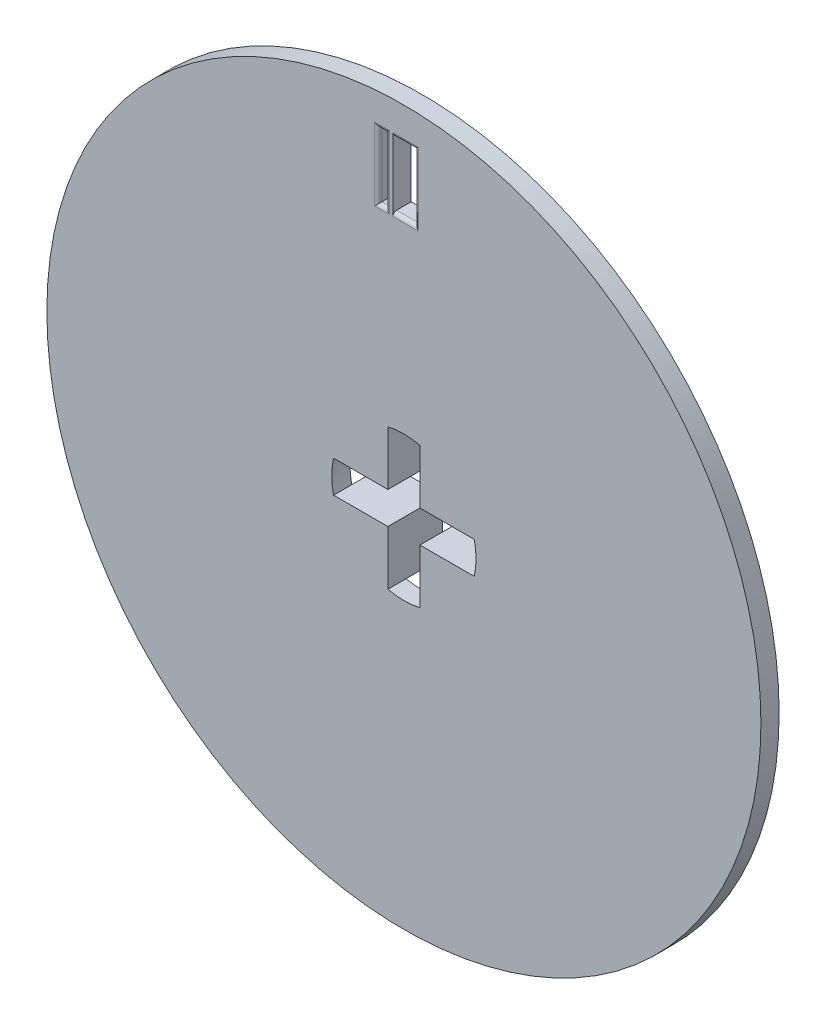
ISO-10303-21;
HEADER;
FILE_DESCRIPTION(('STEP AP214'),'2;1');
FILE_NAME('part.step','',(''),(''),'','','');
FILE_SCHEMA(('AUTOMOTIVE_DESIGN { 1 0 10303 214 1 1 1 1 }'));
ENDSEC;
DATA;
#1=APPLICATION_CONTEXT('core data for automotive mechanical design processes');
#2=APPLICATION_PROTOCOL_DEFINITION('international standard','automotive_design',2000,#1);
#3=PRODUCT_CONTEXT('',#1,'mechanical');
#4=PRODUCT('Part','Part','',(#3));
#5=PRODUCT_RELATED_PRODUCT_CATEGORY('part','',(#4));
#6=PRODUCT_DEFINITION_FORMATION('','',#4);
#7=PRODUCT_DEFINITION_CONTEXT('part definition',#1,'design');
#8=PRODUCT_DEFINITION('design','',#6,#7);
#9=PRODUCT_DEFINITION_SHAPE('','',#8);
#10=(LENGTH_UNIT() NAMED_UNIT(*) SI_UNIT(.MILLI.,.METRE.));
#11=(NAMED_UNIT(*) PLANE_ANGLE_UNIT() SI_UNIT($,.RADIAN.));
#12=(NAMED_UNIT(*) SI_UNIT($,.STERADIAN.) SOLID_ANGLE_UNIT());
#13=UNCERTAINTY_MEASURE_WITH_UNIT(LENGTH_MEASURE(1.E-05),#10,'distance_accuracy_value','');
#14=(GEOMETRIC_REPRESENTATION_CONTEXT(3) GLOBAL_UNCERTAINTY_ASSIGNED_CONTEXT((#13)) GLOBAL_UNIT_ASSIGNED_CONTEXT((#10,
#11,#12)) REPRESENTATION_CONTEXT('',''));
#15=CARTESIAN_POINT('',(0.,0.,0.));
#16=DIRECTION('',(0.,0.,1.));
#17=DIRECTION('',(1.,0.,0.));
#18=AXIS2_PLACEMENT_3D('',#15,#16,#17);
#19=CARTESIAN_POINT('',(0.,0.,2.5));
#20=DIRECTION('',(0.,0.,-1.));
#21=DIRECTION('',(-1.,0.,0.));
#22=AXIS2_PLACEMENT_3D('',#19,#20,#21);
#23=CYLINDRICAL_SURFACE('',#22,9.9);
#24=CARTESIAN_POINT('',(0.,0.,0.));
#25=DIRECTION('',(0.,0.,1.));
#26=DIRECTION('',(1.,0.,0.));
#27=AXIS2_PLACEMENT_3D('',#24,#25,#26);
#28=CIRCLE('',#27,9.9);
#29=CARTESIAN_POINT('',(9.65246082613134,-2.2,0.));
#30=VERTEX_POINT('',#29);
#31=CARTESIAN_POINT('',(9.65246082613134,2.2,0.));
#32=VERTEX_POINT('',#31);
#33=EDGE_CURVE('E456',#30,#32,#28,.T.);
#34=ORIENTED_EDGE('',*,*,#33,.F.);
#35=DIRECTION('',(0.,0.,-1.));
#36=VECTOR('',#35,1.);
#37=CARTESIAN_POINT('',(9.65246082613133,-2.2,2.5));
#38=LINE('',#37,#36);
#39=CARTESIAN_POINT('',(9.65246082613133,-2.2,2.5));
#40=VERTEX_POINT('',#39);
#41=EDGE_CURVE('E278',#40,#30,#38,.T.);
#42=ORIENTED_EDGE('',*,*,#41,.F.);
#43=CARTESIAN_POINT('',(0.,0.,2.5));
#44=DIRECTION('',(0.,0.,1.));
#45=DIRECTION('',(1.,0.,0.));
#46=AXIS2_PLACEMENT_3D('',#43,#44,#45);
#47=CIRCLE('',#46,9.9);
#48=CARTESIAN_POINT('',(9.65246082613134,2.2,2.5));
#49=VERTEX_POINT('',#48);
#50=EDGE_CURVE('E412',#40,#49,#47,.T.);
#51=ORIENTED_EDGE('',*,*,#50,.T.);
#52=DIRECTION('',(0.,0.,-1.));
#53=VECTOR('',#52,1.);
#54=CARTESIAN_POINT('',(9.65246082613134,2.2,2.5));
#55=LINE('',#54,#53);
#56=EDGE_CURVE('E352',#49,#32,#55,.T.);
#57=ORIENTED_EDGE('',*,*,#56,.T.);
#58=EDGE_LOOP('',(#34,#42,#51,#57));
#59=FACE_BOUND('',#58,.T.);
#60=ADVANCED_FACE('F41',(#59),#23,.F.);
#61=CARTESIAN_POINT('',(-2.2,-9.65246082613134,2.5));
#62=VERTEX_POINT('',#61);
#63=CARTESIAN_POINT('',(2.2,-9.65246082613134,2.5));
#64=VERTEX_POINT('',#63);
#65=EDGE_CURVE('E411',#62,#64,#47,.T.);
#66=ORIENTED_EDGE('',*,*,#65,.T.);
#67=DIRECTION('',(0.,0.,-1.));
#68=VECTOR('',#67,1.);
#69=CARTESIAN_POINT('',(2.2,-9.65246082613134,2.5));
#70=LINE('',#69,#68);
#71=CARTESIAN_POINT('',(2.2,-9.65246082613134,0.));
#72=VERTEX_POINT('',#71);
#73=EDGE_CURVE('E273',#64,#72,#70,.T.);
#74=ORIENTED_EDGE('',*,*,#73,.T.);
#75=CARTESIAN_POINT('',(-2.2,-9.65246082613134,0.));
#76=VERTEX_POINT('',#75);
#77=EDGE_CURVE('E455',#76,#72,#28,.T.);
#78=ORIENTED_EDGE('',*,*,#77,.F.);
#79=DIRECTION('',(0.,0.,-1.));
#80=VECTOR('',#79,1.);
#81=CARTESIAN_POINT('',(-2.2,-9.65246082613134,2.5));
#82=LINE('',#81,#80);
#83=EDGE_CURVE('E312',#62,#76,#82,.T.);
#84=ORIENTED_EDGE('',*,*,#83,.F.);
#85=EDGE_LOOP('',(#66,#74,#78,#84));
#86=FACE_BOUND('',#85,.T.);
#87=ADVANCED_FACE('F614',(#86),#23,.F.);
#88=CARTESIAN_POINT('',(-9.65246082613134,2.2,2.5));
#89=VERTEX_POINT('',#88);
#90=CARTESIAN_POINT('',(-9.65246082613134,-2.2,2.5));
#91=VERTEX_POINT('',#90);
#92=EDGE_CURVE('E406',#89,#91,#47,.T.);
#93=ORIENTED_EDGE('',*,*,#92,.T.);
#94=DIRECTION('',(0.,0.,-1.));
#95=VECTOR('',#94,1.);
#96=CARTESIAN_POINT('',(-9.65246082613134,-2.2,2.5));
#97=LINE('',#96,#95);
#98=CARTESIAN_POINT('',(-9.65246082613134,-2.2,0.));
#99=VERTEX_POINT('',#98);
#100=EDGE_CURVE('E316',#91,#99,#97,.T.);
#101=ORIENTED_EDGE('',*,*,#100,.T.);
#102=CARTESIAN_POINT('',(-9.65246082613134,2.2,0.));
#103=VERTEX_POINT('',#102);
#104=EDGE_CURVE('E451',#103,#99,#28,.T.);
#105=ORIENTED_EDGE('',*,*,#104,.F.);
#106=DIRECTION('',(0.,0.,-1.));
#107=VECTOR('',#106,1.);
#108=CARTESIAN_POINT('',(-9.65246082613134,2.2,2.5));
#109=LINE('',#108,#107);
#110=EDGE_CURVE('E396',#89,#103,#109,.T.);
#111=ORIENTED_EDGE('',*,*,#110,.F.);
#112=EDGE_LOOP('',(#93,#101,#105,#111));
#113=FACE_BOUND('',#112,.T.);
#114=ADVANCED_FACE('F621',(#113),#23,.F.);
#115=CARTESIAN_POINT('',(2.2,9.65246082613134,0.));
#116=VERTEX_POINT('',#115);
#117=CARTESIAN_POINT('',(-2.2,9.65246082613134,0.));
#118=VERTEX_POINT('',#117);
#119=EDGE_CURVE('E450',#116,#118,#28,.T.);
#120=ORIENTED_EDGE('',*,*,#119,.F.);
#121=DIRECTION('',(0.,0.,-1.));
#122=VECTOR('',#121,1.);
#123=CARTESIAN_POINT('',(2.2,9.65246082613134,2.5));
#124=LINE('',#123,#122);
#125=CARTESIAN_POINT('',(2.2,9.65246082613134,2.5));
#126=VERTEX_POINT('',#125);
#127=EDGE_CURVE('E359',#126,#116,#124,.T.);
#128=ORIENTED_EDGE('',*,*,#127,.F.);
#129=CARTESIAN_POINT('',(-2.2,9.65246082613134,2.5));
#130=VERTEX_POINT('',#129);
#131=EDGE_CURVE('E404',#126,#130,#47,.T.);
#132=ORIENTED_EDGE('',*,*,#131,.T.);
#133=DIRECTION('',(0.,0.,-1.));
#134=VECTOR('',#133,1.);
#135=CARTESIAN_POINT('',(-2.2,9.65246082613134,2.5));
#136=LINE('',#135,#134);
#137=EDGE_CURVE('E389',#130,#118,#136,.T.);
#138=ORIENTED_EDGE('',*,*,#137,.T.);
#139=EDGE_LOOP('',(#120,#128,#132,#138));
#140=FACE_BOUND('',#139,.T.);
#141=ADVANCED_FACE('F617',(#140),#23,.F.);
#142=CARTESIAN_POINT('',(0.,44.5,2.5));
#143=DIRECTION('',(0.,1.,0.));
#144=DIRECTION('',(0.,0.,1.));
#145=AXIS2_PLACEMENT_3D('',#142,#143,#144);
#146=PLANE('',#145);
#147=DIRECTION('',(0.,0.,-1.));
#148=VECTOR('',#147,1.);
#149=CARTESIAN_POINT('',(-2.50000000000001,44.5,2.5));
#150=LINE('',#149,#148);
#151=CARTESIAN_POINT('',(-2.50000000000001,44.5,2.));
#152=VERTEX_POINT('',#151);
#153=CARTESIAN_POINT('',(-2.50000000000001,44.5,0.));
#154=VERTEX_POINT('',#153);
#155=EDGE_CURVE('E470',#152,#154,#150,.T.);
#156=ORIENTED_EDGE('',*,*,#155,.F.);
#157=DIRECTION('',(1.,0.,0.));
#158=VECTOR('',#157,1.);
#159=CARTESIAN_POINT('',(-3.50000000000001,44.5,2.));
#160=LINE('',#159,#158);
#161=CARTESIAN_POINT('',(-3.50000000000001,44.5,2.));
#162=VERTEX_POINT('',#161);
#163=EDGE_CURVE('E510',#152,#162,#160,.F.);
#164=ORIENTED_EDGE('',*,*,#163,.T.);
#165=DIRECTION('',(0.,0.,-1.));
#166=VECTOR('',#165,1.);
#167=CARTESIAN_POINT('',(-3.50000000000001,44.5,2.5));
#168=LINE('',#167,#166);
#169=CARTESIAN_POINT('',(-3.50000000000001,44.5,0.));
#170=VERTEX_POINT('',#169);
#171=EDGE_CURVE('E460',#162,#170,#168,.T.);
#172=ORIENTED_EDGE('',*,*,#171,.T.);
#173=DIRECTION('',(1.,0.,0.));
#174=VECTOR('',#173,1.);
#175=CARTESIAN_POINT('',(0.,44.5,0.));
#176=LINE('',#175,#174);
#177=EDGE_CURVE('E434',#170,#154,#176,.T.);
#178=ORIENTED_EDGE('',*,*,#177,.T.);
#179=EDGE_LOOP('',(#156,#164,#172,#178));
#180=FACE_BOUND('',#179,.T.);
#181=ADVANCED_FACE('F576',(#180),#146,.F.);
#182=CARTESIAN_POINT('',(-2.50000000000001,0.,2.5));
#183=DIRECTION('',(1.,0.,0.));
#184=DIRECTION('',(0.,0.,-1.));
#185=AXIS2_PLACEMENT_3D('',#182,#183,#184);
#186=PLANE('',#185);
#187=DIRECTION('',(0.,0.,-1.));
#188=VECTOR('',#187,1.);
#189=CARTESIAN_POINT('',(-2.50000000000001,35.5,2.5));
#190=LINE('',#189,#188);
#191=CARTESIAN_POINT('',(-2.50000000000001,35.5,2.));
#192=VERTEX_POINT('',#191);
#193=CARTESIAN_POINT('',(-2.50000000000001,35.5,0.));
#194=VERTEX_POINT('',#193);
#195=EDGE_CURVE('E467',#192,#194,#190,.T.);
#196=ORIENTED_EDGE('',*,*,#195,.F.);
#197=DIRECTION('',(0.,-1.,0.));
#198=VECTOR('',#197,1.);
#199=CARTESIAN_POINT('',(-2.50000000000001,44.5,2.));
#200=LINE('',#199,#198);
#201=EDGE_CURVE('E517',#192,#152,#200,.F.);
#202=ORIENTED_EDGE('',*,*,#201,.T.);
#203=ORIENTED_EDGE('',*,*,#155,.T.);
#204=DIRECTION('',(0.,-1.,0.));
#205=VECTOR('',#204,1.);
#206=CARTESIAN_POINT('',(-2.50000000000001,0.,0.));
#207=LINE('',#206,#205);
#208=EDGE_CURVE('E438',#154,#194,#207,.T.);
#209=ORIENTED_EDGE('',*,*,#208,.T.);
#210=EDGE_LOOP('',(#196,#202,#203,#209));
#211=FACE_BOUND('',#210,.T.);
#212=ADVANCED_FACE('F563',(#211),#186,.F.);
#213=CARTESIAN_POINT('',(0.,35.5,2.5));
#214=DIRECTION('',(0.,-1.,0.));
#215=DIRECTION('',(0.,0.,-1.));
#216=AXIS2_PLACEMENT_3D('',#213,#214,#215);
#217=PLANE('',#216);
#218=DIRECTION('',(0.,0.,-1.));
#219=VECTOR('',#218,1.);
#220=CARTESIAN_POINT('',(-3.50000000000001,35.5,2.5));
#221=LINE('',#220,#219);
#222=CARTESIAN_POINT('',(-3.50000000000001,35.5,2.));
#223=VERTEX_POINT('',#222);
#224=CARTESIAN_POINT('',(-3.50000000000001,35.5,0.));
#225=VERTEX_POINT('',#224);
#226=EDGE_CURVE('E463',#223,#225,#221,.T.);
#227=ORIENTED_EDGE('',*,*,#226,.F.);
#228=DIRECTION('',(-1.,0.,0.));
#229=VECTOR('',#228,1.);
#230=CARTESIAN_POINT('',(-2.50000000000001,35.5,2.));
#231=LINE('',#230,#229);
#232=EDGE_CURVE('E514',#223,#192,#231,.F.);
#233=ORIENTED_EDGE('',*,*,#232,.T.);
#234=ORIENTED_EDGE('',*,*,#195,.T.);
#235=DIRECTION('',(-1.,0.,0.));
#236=VECTOR('',#235,1.);
#237=CARTESIAN_POINT('',(0.,35.5,0.));
#238=LINE('',#237,#236);
#239=EDGE_CURVE('E442',#194,#225,#238,.T.);
#240=ORIENTED_EDGE('',*,*,#239,.T.);
#241=EDGE_LOOP('',(#227,#233,#234,#240));
#242=FACE_BOUND('',#241,.T.);
#243=ADVANCED_FACE('F561',(#242),#217,.F.);
#244=CARTESIAN_POINT('',(1.5,0.,2.5));
#245=DIRECTION('',(1.,0.,0.));
#246=DIRECTION('',(0.,1.,0.));
#247=AXIS2_PLACEMENT_3D('',#244,#245,#246);
#248=PLANE('',#247);
#249=DIRECTION('',(0.,0.,-1.));
#250=VECTOR('',#249,1.);
#251=CARTESIAN_POINT('',(1.49999999999999,35.5,2.5));
#252=LINE('',#251,#250);
#253=CARTESIAN_POINT('',(1.49999999999999,35.5,2.));
#254=VERTEX_POINT('',#253);
#255=CARTESIAN_POINT('',(1.49999999999999,35.5,0.));
#256=VERTEX_POINT('',#255);
#257=EDGE_CURVE('E464',#254,#256,#252,.T.);
#258=ORIENTED_EDGE('',*,*,#257,.F.);
#259=DIRECTION('',(0.,-1.,0.));
#260=VECTOR('',#259,1.);
#261=CARTESIAN_POINT('',(1.49999999999999,44.5,2.));
#262=LINE('',#261,#260);
#263=CARTESIAN_POINT('',(1.49999999999999,44.5,2.));
#264=VERTEX_POINT('',#263);
#265=EDGE_CURVE('E525',#254,#264,#262,.F.);
#266=ORIENTED_EDGE('',*,*,#265,.T.);
#267=DIRECTION('',(0.,0.,-1.));
#268=VECTOR('',#267,1.);
#269=CARTESIAN_POINT('',(1.49999999999999,44.5,2.5));
#270=LINE('',#269,#268);
#271=CARTESIAN_POINT('',(1.49999999999999,44.5,0.));
#272=VERTEX_POINT('',#271);
#273=EDGE_CURVE('E416',#264,#272,#270,.T.);
#274=ORIENTED_EDGE('',*,*,#273,.T.);
#275=DIRECTION('',(0.,-1.,0.));
#276=VECTOR('',#275,1.);
#277=CARTESIAN_POINT('',(1.5,0.,0.));
#278=LINE('',#277,#276);
#279=EDGE_CURVE('E417',#272,#256,#278,.T.);
#280=ORIENTED_EDGE('',*,*,#279,.T.);
#281=EDGE_LOOP('',(#258,#266,#274,#280));
#282=FACE_BOUND('',#281,.T.);
#283=ADVANCED_FACE('F742',(#282),#248,.F.);
#284=CARTESIAN_POINT('',(0.,35.5,2.5));
#285=DIRECTION('',(0.,1.,0.));
#286=DIRECTION('',(0.,0.,1.));
#287=AXIS2_PLACEMENT_3D('',#284,#285,#286);
#288=PLANE('',#287);
#289=DIRECTION('',(0.,0.,-1.));
#290=VECTOR('',#289,1.);
#291=CARTESIAN_POINT('',(-1.50000000000001,35.5,2.5));
#292=LINE('',#291,#290);
#293=CARTESIAN_POINT('',(-1.50000000000001,35.5,2.));
#294=VERTEX_POINT('',#293);
#295=CARTESIAN_POINT('',(-1.50000000000001,35.5,0.));
#296=VERTEX_POINT('',#295);
#297=EDGE_CURVE('E479',#294,#296,#292,.T.);
#298=ORIENTED_EDGE('',*,*,#297,.F.);
#299=DIRECTION('',(1.,0.,0.));
#300=VECTOR('',#299,1.);
#301=CARTESIAN_POINT('',(0.,35.5,2.));
#302=LINE('',#301,#300);
#303=EDGE_CURVE('E473',#294,#254,#302,.T.);
#304=ORIENTED_EDGE('',*,*,#303,.T.);
#305=ORIENTED_EDGE('',*,*,#257,.T.);
#306=DIRECTION('',(1.,0.,0.));
#307=VECTOR('',#306,1.);
#308=CARTESIAN_POINT('',(0.,35.5,0.));
#309=LINE('',#308,#307);
#310=EDGE_CURVE('E421',#296,#256,#309,.T.);
#311=ORIENTED_EDGE('',*,*,#310,.F.);
#312=EDGE_LOOP('',(#298,#304,#305,#311));
#313=FACE_BOUND('',#312,.T.);
#314=ADVANCED_FACE('F745',(#313),#288,.T.);
#315=CARTESIAN_POINT('',(-1.5,0.,2.5));
#316=DIRECTION('',(1.,0.,0.));
#317=DIRECTION('',(0.,1.,0.));
#318=AXIS2_PLACEMENT_3D('',#315,#316,#317);
#319=PLANE('',#318);
#320=DIRECTION('',(0.,-1.,0.));
#321=VECTOR('',#320,1.);
#322=CARTESIAN_POINT('',(-1.5,0.,0.));
#323=LINE('',#322,#321);
#324=CARTESIAN_POINT('',(-1.50000000000001,44.5,0.));
#325=VERTEX_POINT('',#324);
#326=EDGE_CURVE('E426',#325,#296,#323,.T.);
#327=ORIENTED_EDGE('',*,*,#326,.F.);
#328=DIRECTION('',(0.,0.,-1.));
#329=VECTOR('',#328,1.);
#330=CARTESIAN_POINT('',(-1.50000000000001,44.5,2.5));
#331=LINE('',#330,#329);
#332=CARTESIAN_POINT('',(-1.50000000000001,44.5,2.));
#333=VERTEX_POINT('',#332);
#334=EDGE_CURVE('E476',#333,#325,#331,.T.);
#335=ORIENTED_EDGE('',*,*,#334,.F.);
#336=CARTESIAN_POINT('',(-1.50000000000001,45.,2.));
#337=DIRECTION('',(1.,0.,0.));
#338=DIRECTION('',(0.,1.,0.));
#339=AXIS2_PLACEMENT_3D('',#336,#337,#338);
#340=CIRCLE('',#339,0.5);
#341=CARTESIAN_POINT('',(-1.50000000000001,45.,2.5));
#342=VERTEX_POINT('',#341);
#343=EDGE_CURVE('E11',#333,#342,#340,.F.);
#344=ORIENTED_EDGE('',*,*,#343,.T.);
#345=DIRECTION('',(0.,-1.,0.));
#346=VECTOR('',#345,1.);
#347=CARTESIAN_POINT('',(-1.5,0.,2.5));
#348=LINE('',#347,#346);
#349=CARTESIAN_POINT('',(-1.50000000000001,35.,2.5));
#350=VERTEX_POINT('',#349);
#351=EDGE_CURVE('E401',#342,#350,#348,.T.);
#352=ORIENTED_EDGE('',*,*,#351,.T.);
#353=CARTESIAN_POINT('',(-1.50000000000001,35.,2.));
#354=DIRECTION('',(1.,0.,0.));
#355=DIRECTION('',(0.,1.,0.));
#356=AXIS2_PLACEMENT_3D('',#353,#354,#355);
#357=CIRCLE('',#356,0.5);
#358=EDGE_CURVE('E51',#350,#294,#357,.F.);
#359=ORIENTED_EDGE('',*,*,#358,.T.);
#360=ORIENTED_EDGE('',*,*,#297,.T.);
#361=EDGE_LOOP('',(#327,#335,#344,#352,#359,#360));
#362=FACE_BOUND('',#361,.T.);
#363=ADVANCED_FACE('F749',(#362),#319,.T.);
#364=CARTESIAN_POINT('',(-3.50000000000001,0.,2.5));
#365=DIRECTION('',(-1.,0.,0.));
#366=DIRECTION('',(0.,0.,1.));
#367=AXIS2_PLACEMENT_3D('',#364,#365,#366);
#368=PLANE('',#367);
#369=ORIENTED_EDGE('',*,*,#171,.F.);
#370=DIRECTION('',(0.,1.,0.));
#371=VECTOR('',#370,1.);
#372=CARTESIAN_POINT('',(-3.50000000000001,35.5,2.));
#373=LINE('',#372,#371);
#374=EDGE_CURVE('E520',#162,#223,#373,.F.);
#375=ORIENTED_EDGE('',*,*,#374,.T.);
#376=ORIENTED_EDGE('',*,*,#226,.T.);
#377=DIRECTION('',(0.,1.,0.));
#378=VECTOR('',#377,1.);
#379=CARTESIAN_POINT('',(-3.50000000000001,0.,0.));
#380=LINE('',#379,#378);
#381=EDGE_CURVE('E446',#225,#170,#380,.T.);
#382=ORIENTED_EDGE('',*,*,#381,.T.);
#383=EDGE_LOOP('',(#369,#375,#376,#382));
#384=FACE_BOUND('',#383,.T.);
#385=ADVANCED_FACE('F574',(#384),#368,.F.);
#386=CARTESIAN_POINT('',(0.,44.5,2.5));
#387=DIRECTION('',(0.,1.,0.));
#388=DIRECTION('',(0.,0.,1.));
#389=AXIS2_PLACEMENT_3D('',#386,#387,#388);
#390=PLANE('',#389);
#391=ORIENTED_EDGE('',*,*,#273,.F.);
#392=DIRECTION('',(1.,0.,0.));
#393=VECTOR('',#392,1.);
#394=CARTESIAN_POINT('',(-1.50000000000001,44.5,2.));
#395=LINE('',#394,#393);
#396=EDGE_CURVE('E67',#264,#333,#395,.F.);
#397=ORIENTED_EDGE('',*,*,#396,.T.);
#398=ORIENTED_EDGE('',*,*,#334,.T.);
#399=DIRECTION('',(1.,0.,0.));
#400=VECTOR('',#399,1.);
#401=CARTESIAN_POINT('',(0.,44.5,0.));
#402=LINE('',#401,#400);
#403=EDGE_CURVE('E430',#325,#272,#402,.T.);
#404=ORIENTED_EDGE('',*,*,#403,.T.);
#405=EDGE_LOOP('',(#391,#397,#398,#404));
#406=FACE_BOUND('',#405,.T.);
#407=ADVANCED_FACE('F598',(#406),#390,.F.);
#408=CARTESIAN_POINT('',(0.,0.,2.5));
#409=DIRECTION('',(0.,0.,-1.));
#410=DIRECTION('',(-1.,0.,0.));
#411=AXIS2_PLACEMENT_3D('',#408,#409,#410);
#412=CYLINDRICAL_SURFACE('',#411,49.);
#413=CARTESIAN_POINT('',(0.,0.,2.5));
#414=DIRECTION('',(0.,0.,1.));
#415=DIRECTION('',(1.,0.,0.));
#416=AXIS2_PLACEMENT_3D('',#413,#414,#415);
#417=CIRCLE('',#416,49.);
#418=CARTESIAN_POINT('',(49.,0.,2.5));
#419=VERTEX_POINT('',#418);
#420=EDGE_CURVE('E410',#419,#419,#417,.T.);
#421=ORIENTED_EDGE('',*,*,#420,.F.);
#422=EDGE_LOOP('',(#421));
#423=FACE_BOUND('',#422,.T.);
#424=CARTESIAN_POINT('',(0.,0.,0.));
#425=DIRECTION('',(0.,0.,1.));
#426=DIRECTION('',(1.,0.,0.));
#427=AXIS2_PLACEMENT_3D('',#424,#425,#426);
#428=CIRCLE('',#427,49.);
#429=CARTESIAN_POINT('',(49.,0.,0.));
#430=VERTEX_POINT('',#429);
#431=EDGE_CURVE('E405',#430,#430,#428,.T.);
#432=ORIENTED_EDGE('',*,*,#431,.T.);
#433=EDGE_LOOP('',(#432));
#434=FACE_BOUND('',#433,.T.);
#435=ADVANCED_FACE('F587',(#423,#434),#412,.T.);
#436=CARTESIAN_POINT('',(0.,0.,2.5));
#437=DIRECTION('',(0.,0.,1.));
#438=DIRECTION('',(1.,0.,0.));
#439=AXIS2_PLACEMENT_3D('',#436,#437,#438);
#440=PLANE('',#439);
#441=DIRECTION('',(1.,0.,0.));
#442=VECTOR('',#441,1.);
#443=CARTESIAN_POINT('',(-2.50000000000001,45.,2.5));
#444=LINE('',#443,#442);
#445=CARTESIAN_POINT('',(-4.00000000000001,45.,2.5));
#446=VERTEX_POINT('',#445);
#447=CARTESIAN_POINT('',(-2.00000000000001,45.,2.5));
#448=VERTEX_POINT('',#447);
#449=EDGE_CURVE('E503',#446,#448,#444,.T.);
#450=ORIENTED_EDGE('',*,*,#449,.T.);
#451=DIRECTION('',(0.,-1.,0.));
#452=VECTOR('',#451,1.);
#453=CARTESIAN_POINT('',(-2.00000000000001,35.5,2.5));
#454=LINE('',#453,#452);
#455=CARTESIAN_POINT('',(-2.00000000000001,35.,2.5));
#456=VERTEX_POINT('',#455);
#457=EDGE_CURVE('E507',#448,#456,#454,.T.);
#458=ORIENTED_EDGE('',*,*,#457,.T.);
#459=DIRECTION('',(-1.,0.,0.));
#460=VECTOR('',#459,1.);
#461=CARTESIAN_POINT('',(-3.50000000000001,35.,2.5));
#462=LINE('',#461,#460);
#463=CARTESIAN_POINT('',(-4.00000000000001,35.,2.5));
#464=VERTEX_POINT('',#463);
#465=EDGE_CURVE('E500',#456,#464,#462,.T.);
#466=ORIENTED_EDGE('',*,*,#465,.T.);
#467=DIRECTION('',(0.,1.,0.));
#468=VECTOR('',#467,1.);
#469=CARTESIAN_POINT('',(-4.00000000000001,44.5,2.5));
#470=LINE('',#469,#468);
#471=EDGE_CURVE('E497',#464,#446,#470,.T.);
#472=ORIENTED_EDGE('',*,*,#471,.T.);
#473=EDGE_LOOP('',(#450,#458,#466,#472));
#474=FACE_BOUND('',#473,.T.);
#475=DIRECTION('',(1.,0.,0.));
#476=VECTOR('',#475,1.);
#477=CARTESIAN_POINT('',(0.,35.,2.5));
#478=LINE('',#477,#476);
#479=CARTESIAN_POINT('',(1.99999999999999,35.,2.5));
#480=VERTEX_POINT('',#479);
#481=EDGE_CURVE('E493',#480,#350,#478,.F.);
#482=ORIENTED_EDGE('',*,*,#481,.T.);
#483=ORIENTED_EDGE('',*,*,#351,.F.);
#484=DIRECTION('',(1.,0.,0.));
#485=VECTOR('',#484,1.);
#486=CARTESIAN_POINT('',(1.49999999999999,45.,2.5));
#487=LINE('',#486,#485);
#488=CARTESIAN_POINT('',(1.99999999999999,45.,2.5));
#489=VERTEX_POINT('',#488);
#490=EDGE_CURVE('E490',#342,#489,#487,.T.);
#491=ORIENTED_EDGE('',*,*,#490,.T.);
#492=DIRECTION('',(0.,-1.,0.));
#493=VECTOR('',#492,1.);
#494=CARTESIAN_POINT('',(1.99999999999999,35.5,2.5));
#495=LINE('',#494,#493);
#496=EDGE_CURVE('E487',#489,#480,#495,.T.);
#497=ORIENTED_EDGE('',*,*,#496,.T.);
#498=EDGE_LOOP('',(#482,#483,#491,#497));
#499=FACE_BOUND('',#498,.T.);
#500=ORIENTED_EDGE('',*,*,#92,.F.);
#501=DIRECTION('',(1.,0.,0.));
#502=VECTOR('',#501,1.);
#503=CARTESIAN_POINT('',(-9.65246082613134,2.2,2.5));
#504=LINE('',#503,#502);
#505=CARTESIAN_POINT('',(-2.2,2.2,2.5));
#506=VERTEX_POINT('',#505);
#507=EDGE_CURVE('E379',#89,#506,#504,.T.);
#508=ORIENTED_EDGE('',*,*,#507,.T.);
#509=DIRECTION('',(0.,1.,0.));
#510=VECTOR('',#509,1.);
#511=CARTESIAN_POINT('',(-2.2,2.2,2.5));
#512=LINE('',#511,#510);
#513=EDGE_CURVE('E385',#506,#130,#512,.T.);
#514=ORIENTED_EDGE('',*,*,#513,.T.);
#515=ORIENTED_EDGE('',*,*,#131,.F.);
#516=DIRECTION('',(0.,-1.,0.));
#517=VECTOR('',#516,1.);
#518=CARTESIAN_POINT('',(2.2,9.65246082613134,2.5));
#519=LINE('',#518,#517);
#520=CARTESIAN_POINT('',(2.2,2.2,2.5));
#521=VERTEX_POINT('',#520);
#522=EDGE_CURVE('E342',#126,#521,#519,.T.);
#523=ORIENTED_EDGE('',*,*,#522,.T.);
#524=DIRECTION('',(1.,0.,0.));
#525=VECTOR('',#524,1.);
#526=CARTESIAN_POINT('',(2.2,2.2,2.5));
#527=LINE('',#526,#525);
#528=EDGE_CURVE('E348',#521,#49,#527,.T.);
#529=ORIENTED_EDGE('',*,*,#528,.T.);
#530=ORIENTED_EDGE('',*,*,#50,.F.);
#531=DIRECTION('',(-1.,0.,0.));
#532=VECTOR('',#531,1.);
#533=CARTESIAN_POINT('',(9.65246082613133,-2.2,2.5));
#534=LINE('',#533,#532);
#535=CARTESIAN_POINT('',(2.2,-2.2,2.5));
#536=VERTEX_POINT('',#535);
#537=EDGE_CURVE('E266',#40,#536,#534,.T.);
#538=ORIENTED_EDGE('',*,*,#537,.T.);
#539=DIRECTION('',(0.,-1.,0.));
#540=VECTOR('',#539,1.);
#541=CARTESIAN_POINT('',(2.2,-2.2,2.5));
#542=LINE('',#541,#540);
#543=EDGE_CURVE('E270',#536,#64,#542,.T.);
#544=ORIENTED_EDGE('',*,*,#543,.T.);
#545=ORIENTED_EDGE('',*,*,#65,.F.);
#546=DIRECTION('',(0.,1.,0.));
#547=VECTOR('',#546,1.);
#548=CARTESIAN_POINT('',(-2.2,-9.65246082613134,2.5));
#549=LINE('',#548,#547);
#550=CARTESIAN_POINT('',(-2.2,-2.2,2.5));
#551=VERTEX_POINT('',#550);
#552=EDGE_CURVE('E302',#62,#551,#549,.T.);
#553=ORIENTED_EDGE('',*,*,#552,.T.);
#554=DIRECTION('',(-1.,0.,0.));
#555=VECTOR('',#554,1.);
#556=CARTESIAN_POINT('',(-2.2,-2.2,2.5));
#557=LINE('',#556,#555);
#558=EDGE_CURVE('E309',#551,#91,#557,.T.);
#559=ORIENTED_EDGE('',*,*,#558,.T.);
#560=EDGE_LOOP('',(#500,#508,#514,#515,#523,#529,#530,#538,#544,#545,#553,#559));
#561=FACE_BOUND('',#560,.T.);
#562=ORIENTED_EDGE('',*,*,#420,.T.);
#563=EDGE_LOOP('',(#562));
#564=FACE_BOUND('',#563,.T.);
#565=ADVANCED_FACE('F584',(#474,#499,#561,#564),#440,.T.);
#566=CARTESIAN_POINT('',(0.,0.,0.));
#567=DIRECTION('',(0.,0.,1.));
#568=DIRECTION('',(1.,0.,0.));
#569=AXIS2_PLACEMENT_3D('',#566,#567,#568);
#570=PLANE('',#569);
#571=ORIENTED_EDGE('',*,*,#279,.F.);
#572=ORIENTED_EDGE('',*,*,#403,.F.);
#573=ORIENTED_EDGE('',*,*,#326,.T.);
#574=ORIENTED_EDGE('',*,*,#310,.T.);
#575=EDGE_LOOP('',(#571,#572,#573,#574));
#576=FACE_BOUND('',#575,.T.);
#577=ORIENTED_EDGE('',*,*,#177,.F.);
#578=ORIENTED_EDGE('',*,*,#381,.F.);
#579=ORIENTED_EDGE('',*,*,#239,.F.);
#580=ORIENTED_EDGE('',*,*,#208,.F.);
#581=EDGE_LOOP('',(#577,#578,#579,#580));
#582=FACE_BOUND('',#581,.T.);
#583=ORIENTED_EDGE('',*,*,#77,.T.);
#584=CARTESIAN_POINT('',(0.,0.,0.));
#585=DIRECTION('',(0.,0.,1.));
#586=DIRECTION('',(1.,0.,0.));
#587=AXIS2_PLACEMENT_3D('',#584,#585,#586);
#588=CIRCLE('',#587,9.9);
#589=EDGE_CURVE('E239',#72,#30,#588,.T.);
#590=ORIENTED_EDGE('',*,*,#589,.T.);
#591=ORIENTED_EDGE('',*,*,#33,.T.);
#592=CARTESIAN_POINT('',(0.,0.,0.));
#593=DIRECTION('',(0.,0.,1.));
#594=DIRECTION('',(1.,0.,0.));
#595=AXIS2_PLACEMENT_3D('',#592,#593,#594);
#596=CIRCLE('',#595,9.9);
#597=EDGE_CURVE('E323',#32,#116,#596,.T.);
#598=ORIENTED_EDGE('',*,*,#597,.T.);
#599=ORIENTED_EDGE('',*,*,#119,.T.);
#600=CARTESIAN_POINT('',(0.,0.,0.));
#601=DIRECTION('',(0.,0.,1.));
#602=DIRECTION('',(1.,0.,0.));
#603=AXIS2_PLACEMENT_3D('',#600,#601,#602);
#604=CIRCLE('',#603,9.9);
#605=EDGE_CURVE('E363',#118,#103,#604,.T.);
#606=ORIENTED_EDGE('',*,*,#605,.T.);
#607=ORIENTED_EDGE('',*,*,#104,.T.);
#608=CARTESIAN_POINT('',(0.,0.,0.));
#609=DIRECTION('',(0.,0.,1.));
#610=DIRECTION('',(1.,0.,0.));
#611=AXIS2_PLACEMENT_3D('',#608,#609,#610);
#612=CIRCLE('',#611,9.9);
#613=EDGE_CURVE('E282',#99,#76,#612,.T.);
#614=ORIENTED_EDGE('',*,*,#613,.T.);
#615=EDGE_LOOP('',(#583,#590,#591,#598,#599,#606,#607,#614));
#616=FACE_BOUND('',#615,.T.);
#617=ORIENTED_EDGE('',*,*,#431,.F.);
#618=EDGE_LOOP('',(#617));
#619=FACE_BOUND('',#618,.T.);
#620=ADVANCED_FACE('F570',(#576,#582,#616,#619),#570,.F.);
#621=CARTESIAN_POINT('',(0.,45.,2.));
#622=DIRECTION('',(-1.,0.,0.));
#623=DIRECTION('',(0.,0.,1.));
#624=AXIS2_PLACEMENT_3D('',#621,#622,#623);
#625=CYLINDRICAL_SURFACE('',#624,0.5);
#626=ORIENTED_EDGE('',*,*,#343,.F.);
#627=ORIENTED_EDGE('',*,*,#396,.F.);
#628=CARTESIAN_POINT('',(1.99999999999999,45.,2.));
#629=DIRECTION('',(-0.707106781186548,0.707106781186547,0.));
#630=DIRECTION('',(-0.707106781186547,-0.707106781186548,0.));
#631=AXIS2_PLACEMENT_3D('',#628,#629,#630);
#632=ELLIPSE('',#631,0.707106781186547,0.5);
#633=EDGE_CURVE('E422',#489,#264,#632,.F.);
#634=ORIENTED_EDGE('',*,*,#633,.F.);
#635=ORIENTED_EDGE('',*,*,#490,.F.);
#636=EDGE_LOOP('',(#626,#627,#634,#635));
#637=FACE_BOUND('',#636,.T.);
#638=ADVANCED_FACE('F603',(#637),#625,.T.);
#639=CARTESIAN_POINT('',(2.,0.,2.));
#640=DIRECTION('',(0.,1.,0.));
#641=DIRECTION('',(-1.,0.,0.));
#642=AXIS2_PLACEMENT_3D('',#639,#640,#641);
#643=CYLINDRICAL_SURFACE('',#642,0.5);
#644=ORIENTED_EDGE('',*,*,#633,.T.);
#645=ORIENTED_EDGE('',*,*,#265,.F.);
#646=CARTESIAN_POINT('',(1.99999999999999,35.,2.));
#647=DIRECTION('',(0.707106781186547,0.707106781186548,0.));
#648=DIRECTION('',(0.707106781186548,-0.707106781186547,0.));
#649=AXIS2_PLACEMENT_3D('',#646,#647,#648);
#650=ELLIPSE('',#649,0.707106781186548,0.5);
#651=EDGE_CURVE('E530',#480,#254,#650,.F.);
#652=ORIENTED_EDGE('',*,*,#651,.F.);
#653=ORIENTED_EDGE('',*,*,#496,.F.);
#654=EDGE_LOOP('',(#644,#645,#652,#653));
#655=FACE_BOUND('',#654,.T.);
#656=ADVANCED_FACE('F609',(#655),#643,.T.);
#657=CARTESIAN_POINT('',(0.,35.,2.));
#658=DIRECTION('',(1.,0.,0.));
#659=DIRECTION('',(0.,0.,-1.));
#660=AXIS2_PLACEMENT_3D('',#657,#658,#659);
#661=CYLINDRICAL_SURFACE('',#660,0.5);
#662=ORIENTED_EDGE('',*,*,#358,.F.);
#663=ORIENTED_EDGE('',*,*,#481,.F.);
#664=ORIENTED_EDGE('',*,*,#651,.T.);
#665=ORIENTED_EDGE('',*,*,#303,.F.);
#666=EDGE_LOOP('',(#662,#663,#664,#665));
#667=FACE_BOUND('',#666,.T.);
#668=ADVANCED_FACE('F731',(#667),#661,.T.);
#669=CARTESIAN_POINT('',(0.,35.,2.));
#670=DIRECTION('',(1.,0.,0.));
#671=DIRECTION('',(0.,0.,-1.));
#672=AXIS2_PLACEMENT_3D('',#669,#670,#671);
#673=CYLINDRICAL_SURFACE('',#672,0.5);
#674=CARTESIAN_POINT('',(-2.00000000000001,35.,2.));
#675=DIRECTION('',(0.707106781186547,0.707106781186547,0.));
#676=DIRECTION('',(0.707106781186547,-0.707106781186547,0.));
#677=AXIS2_PLACEMENT_3D('',#674,#675,#676);
#678=ELLIPSE('',#677,0.707106781186547,0.5);
#679=EDGE_CURVE('E540',#192,#456,#678,.T.);
#680=ORIENTED_EDGE('',*,*,#679,.F.);
#681=ORIENTED_EDGE('',*,*,#232,.F.);
#682=CARTESIAN_POINT('',(-4.00000000000001,35.,2.));
#683=DIRECTION('',(0.707106781186547,-0.707106781186547,0.));
#684=DIRECTION('',(0.707106781186547,0.707106781186547,0.));
#685=AXIS2_PLACEMENT_3D('',#682,#683,#684);
#686=ELLIPSE('',#685,0.707106781186547,0.5);
#687=EDGE_CURVE('E45',#464,#223,#686,.F.);
#688=ORIENTED_EDGE('',*,*,#687,.F.);
#689=ORIENTED_EDGE('',*,*,#465,.F.);
#690=EDGE_LOOP('',(#680,#681,#688,#689));
#691=FACE_BOUND('',#690,.T.);
#692=ADVANCED_FACE('F43',(#691),#673,.T.);
#693=CARTESIAN_POINT('',(-4.00000000000001,0.,2.));
#694=DIRECTION('',(0.,-1.,0.));
#695=DIRECTION('',(0.,0.,-1.));
#696=AXIS2_PLACEMENT_3D('',#693,#694,#695);
#697=CYLINDRICAL_SURFACE('',#696,0.5);
#698=ORIENTED_EDGE('',*,*,#687,.T.);
#699=ORIENTED_EDGE('',*,*,#374,.F.);
#700=CARTESIAN_POINT('',(-4.00000000000001,45.,2.));
#701=DIRECTION('',(-0.707106781186547,-0.707106781186547,0.));
#702=DIRECTION('',(-0.707106781186547,0.707106781186547,0.));
#703=AXIS2_PLACEMENT_3D('',#700,#701,#702);
#704=ELLIPSE('',#703,0.707106781186547,0.5);
#705=EDGE_CURVE('E538',#446,#162,#704,.F.);
#706=ORIENTED_EDGE('',*,*,#705,.F.);
#707=ORIENTED_EDGE('',*,*,#471,.F.);
#708=EDGE_LOOP('',(#698,#699,#706,#707));
#709=FACE_BOUND('',#708,.T.);
#710=ADVANCED_FACE('F553',(#709),#697,.T.);
#711=CARTESIAN_POINT('',(-2.00000000000001,0.,2.));
#712=DIRECTION('',(0.,1.,0.));
#713=DIRECTION('',(0.,0.,1.));
#714=AXIS2_PLACEMENT_3D('',#711,#712,#713);
#715=CYLINDRICAL_SURFACE('',#714,0.5);
#716=ORIENTED_EDGE('',*,*,#679,.T.);
#717=ORIENTED_EDGE('',*,*,#457,.F.);
#718=CARTESIAN_POINT('',(-2.00000000000001,45.,2.));
#719=DIRECTION('',(-0.707106781186547,0.707106781186547,0.));
#720=DIRECTION('',(-0.707106781186547,-0.707106781186547,0.));
#721=AXIS2_PLACEMENT_3D('',#718,#719,#720);
#722=ELLIPSE('',#721,0.707106781186547,0.5);
#723=EDGE_CURVE('E400',#152,#448,#722,.T.);
#724=ORIENTED_EDGE('',*,*,#723,.F.);
#725=ORIENTED_EDGE('',*,*,#201,.F.);
#726=EDGE_LOOP('',(#716,#717,#724,#725));
#727=FACE_BOUND('',#726,.T.);
#728=ADVANCED_FACE('F582',(#727),#715,.T.);
#729=CARTESIAN_POINT('',(0.,45.,2.));
#730=DIRECTION('',(-1.,0.,0.));
#731=DIRECTION('',(0.,0.,1.));
#732=AXIS2_PLACEMENT_3D('',#729,#730,#731);
#733=CYLINDRICAL_SURFACE('',#732,0.5);
#734=ORIENTED_EDGE('',*,*,#705,.T.);
#735=ORIENTED_EDGE('',*,*,#163,.F.);
#736=ORIENTED_EDGE('',*,*,#723,.T.);
#737=ORIENTED_EDGE('',*,*,#449,.F.);
#738=EDGE_LOOP('',(#734,#735,#736,#737));
#739=FACE_BOUND('',#738,.T.);
#740=ADVANCED_FACE('F580',(#739),#733,.T.);
#741=CARTESIAN_POINT('',(-9.65246082613134,2.2,2.5));
#742=DIRECTION('',(0.,1.,0.));
#743=DIRECTION('',(-1.,0.,0.));
#744=AXIS2_PLACEMENT_3D('',#741,#742,#743);
#745=PLANE('',#744);
#746=ORIENTED_EDGE('',*,*,#110,.T.);
#747=DIRECTION('',(0.,0.,1.));
#748=VECTOR('',#747,1.);
#749=CARTESIAN_POINT('',(-9.65246082613134,2.2,-5.));
#750=LINE('',#749,#748);
#751=CARTESIAN_POINT('',(-9.65246082613134,2.2,-5.));
#752=VERTEX_POINT('',#751);
#753=EDGE_CURVE('E59',#752,#103,#750,.T.);
#754=ORIENTED_EDGE('',*,*,#753,.F.);
#755=DIRECTION('',(-1.,0.,0.));
#756=VECTOR('',#755,1.);
#757=CARTESIAN_POINT('',(0.,2.2,-5.));
#758=LINE('',#757,#756);
#759=CARTESIAN_POINT('',(-2.2,2.2,-5.));
#760=VERTEX_POINT('',#759);
#761=EDGE_CURVE('E371',#760,#752,#758,.T.);
#762=ORIENTED_EDGE('',*,*,#761,.F.);
#763=DIRECTION('',(0.,0.,-1.));
#764=VECTOR('',#763,1.);
#765=CARTESIAN_POINT('',(-2.2,2.2,2.5));
#766=LINE('',#765,#764);
#767=EDGE_CURVE('E393',#506,#760,#766,.T.);
#768=ORIENTED_EDGE('',*,*,#767,.F.);
#769=ORIENTED_EDGE('',*,*,#507,.F.);
#770=EDGE_LOOP('',(#746,#754,#762,#768,#769));
#771=FACE_BOUND('',#770,.T.);
#772=ADVANCED_FACE('F678',(#771),#745,.F.);
#773=CARTESIAN_POINT('',(-2.2,2.2,2.5));
#774=DIRECTION('',(-1.,0.,0.));
#775=DIRECTION('',(0.,0.,1.));
#776=AXIS2_PLACEMENT_3D('',#773,#774,#775);
#777=PLANE('',#776);
#778=ORIENTED_EDGE('',*,*,#767,.T.);
#779=DIRECTION('',(0.,1.,0.));
#780=VECTOR('',#779,1.);
#781=CARTESIAN_POINT('',(-2.2,0.,-5.));
#782=LINE('',#781,#780);
#783=CARTESIAN_POINT('',(-2.2,9.65246082613134,-5.));
#784=VERTEX_POINT('',#783);
#785=EDGE_CURVE('E364',#760,#784,#782,.T.);
#786=ORIENTED_EDGE('',*,*,#785,.T.);
#787=DIRECTION('',(0.,0.,1.));
#788=VECTOR('',#787,1.);
#789=CARTESIAN_POINT('',(-2.2,9.65246082613134,-5.));
#790=LINE('',#789,#788);
#791=EDGE_CURVE('E374',#784,#118,#790,.T.);
#792=ORIENTED_EDGE('',*,*,#791,.T.);
#793=ORIENTED_EDGE('',*,*,#137,.F.);
#794=ORIENTED_EDGE('',*,*,#513,.F.);
#795=EDGE_LOOP('',(#778,#786,#792,#793,#794));
#796=FACE_BOUND('',#795,.T.);
#797=ADVANCED_FACE('F671',(#796),#777,.F.);
#798=CARTESIAN_POINT('',(0.,0.,-5.));
#799=DIRECTION('',(0.,0.,1.));
#800=DIRECTION('',(1.,0.,0.));
#801=AXIS2_PLACEMENT_3D('',#798,#799,#800);
#802=CYLINDRICAL_SURFACE('',#801,9.9);
#803=ORIENTED_EDGE('',*,*,#605,.F.);
#804=ORIENTED_EDGE('',*,*,#791,.F.);
#805=CARTESIAN_POINT('',(0.,0.,-5.));
#806=DIRECTION('',(0.,0.,1.));
#807=DIRECTION('',(1.,0.,0.));
#808=AXIS2_PLACEMENT_3D('',#805,#806,#807);
#809=CIRCLE('',#808,9.9);
#810=EDGE_CURVE('E368',#784,#752,#809,.T.);
#811=ORIENTED_EDGE('',*,*,#810,.T.);
#812=ORIENTED_EDGE('',*,*,#753,.T.);
#813=EDGE_LOOP('',(#803,#804,#811,#812));
#814=FACE_BOUND('',#813,.T.);
#815=ADVANCED_FACE('F674',(#814),#802,.T.);
#816=CARTESIAN_POINT('',(0.,0.,-5.));
#817=DIRECTION('',(0.,0.,1.));
#818=DIRECTION('',(1.,0.,0.));
#819=AXIS2_PLACEMENT_3D('',#816,#817,#818);
#820=PLANE('',#819);
#821=ORIENTED_EDGE('',*,*,#785,.F.);
#822=ORIENTED_EDGE('',*,*,#761,.T.);
#823=ORIENTED_EDGE('',*,*,#810,.F.);
#824=EDGE_LOOP('',(#821,#822,#823));
#825=FACE_BOUND('',#824,.T.);
#826=ADVANCED_FACE('F709',(#825),#820,.F.);
#827=CARTESIAN_POINT('',(2.2,9.65246082613134,2.5));
#828=DIRECTION('',(1.,0.,0.));
#829=DIRECTION('',(0.,1.,0.));
#830=AXIS2_PLACEMENT_3D('',#827,#828,#829);
#831=PLANE('',#830);
#832=ORIENTED_EDGE('',*,*,#127,.T.);
#833=DIRECTION('',(0.,0.,1.));
#834=VECTOR('',#833,1.);
#835=CARTESIAN_POINT('',(2.2,9.65246082613134,-5.));
#836=LINE('',#835,#834);
#837=CARTESIAN_POINT('',(2.2,9.65246082613134,-5.));
#838=VERTEX_POINT('',#837);
#839=EDGE_CURVE('E339',#838,#116,#836,.T.);
#840=ORIENTED_EDGE('',*,*,#839,.F.);
#841=DIRECTION('',(0.,1.,0.));
#842=VECTOR('',#841,1.);
#843=CARTESIAN_POINT('',(2.2,0.,-5.));
#844=LINE('',#843,#842);
#845=CARTESIAN_POINT('',(2.2,2.2,-5.));
#846=VERTEX_POINT('',#845);
#847=EDGE_CURVE('E332',#846,#838,#844,.T.);
#848=ORIENTED_EDGE('',*,*,#847,.F.);
#849=DIRECTION('',(0.,0.,-1.));
#850=VECTOR('',#849,1.);
#851=CARTESIAN_POINT('',(2.2,2.2,2.5));
#852=LINE('',#851,#850);
#853=EDGE_CURVE('E356',#521,#846,#852,.T.);
#854=ORIENTED_EDGE('',*,*,#853,.F.);
#855=ORIENTED_EDGE('',*,*,#522,.F.);
#856=EDGE_LOOP('',(#832,#840,#848,#854,#855));
#857=FACE_BOUND('',#856,.T.);
#858=ADVANCED_FACE('F664',(#857),#831,.F.);
#859=CARTESIAN_POINT('',(2.2,2.2,2.5));
#860=DIRECTION('',(0.,1.,0.));
#861=DIRECTION('',(0.,0.,1.));
#862=AXIS2_PLACEMENT_3D('',#859,#860,#861);
#863=PLANE('',#862);
#864=ORIENTED_EDGE('',*,*,#853,.T.);
#865=DIRECTION('',(-1.,0.,0.));
#866=VECTOR('',#865,1.);
#867=CARTESIAN_POINT('',(0.,2.2,-5.));
#868=LINE('',#867,#866);
#869=CARTESIAN_POINT('',(9.65246082613134,2.2,-5.));
#870=VERTEX_POINT('',#869);
#871=EDGE_CURVE('E324',#870,#846,#868,.T.);
#872=ORIENTED_EDGE('',*,*,#871,.F.);
#873=DIRECTION('',(0.,0.,1.));
#874=VECTOR('',#873,1.);
#875=CARTESIAN_POINT('',(9.65246082613134,2.2,-5.));
#876=LINE('',#875,#874);
#877=EDGE_CURVE('E335',#870,#32,#876,.T.);
#878=ORIENTED_EDGE('',*,*,#877,.T.);
#879=ORIENTED_EDGE('',*,*,#56,.F.);
#880=ORIENTED_EDGE('',*,*,#528,.F.);
#881=EDGE_LOOP('',(#864,#872,#878,#879,#880));
#882=FACE_BOUND('',#881,.T.);
#883=ADVANCED_FACE('F656',(#882),#863,.F.);
#884=CARTESIAN_POINT('',(0.,0.,-5.));
#885=DIRECTION('',(0.,0.,1.));
#886=DIRECTION('',(1.,0.,0.));
#887=AXIS2_PLACEMENT_3D('',#884,#885,#886);
#888=CYLINDRICAL_SURFACE('',#887,9.9);
#889=ORIENTED_EDGE('',*,*,#597,.F.);
#890=ORIENTED_EDGE('',*,*,#877,.F.);
#891=CARTESIAN_POINT('',(0.,0.,-5.));
#892=DIRECTION('',(0.,0.,1.));
#893=DIRECTION('',(1.,0.,0.));
#894=AXIS2_PLACEMENT_3D('',#891,#892,#893);
#895=CIRCLE('',#894,9.9);
#896=EDGE_CURVE('E328',#870,#838,#895,.T.);
#897=ORIENTED_EDGE('',*,*,#896,.T.);
#898=ORIENTED_EDGE('',*,*,#839,.T.);
#899=EDGE_LOOP('',(#889,#890,#897,#898));
#900=FACE_BOUND('',#899,.T.);
#901=ADVANCED_FACE('F652',(#900),#888,.T.);
#902=CARTESIAN_POINT('',(0.,0.,-5.));
#903=DIRECTION('',(0.,0.,1.));
#904=DIRECTION('',(1.,0.,0.));
#905=AXIS2_PLACEMENT_3D('',#902,#903,#904);
#906=PLANE('',#905);
#907=ORIENTED_EDGE('',*,*,#871,.T.);
#908=ORIENTED_EDGE('',*,*,#847,.T.);
#909=ORIENTED_EDGE('',*,*,#896,.F.);
#910=EDGE_LOOP('',(#907,#908,#909));
#911=FACE_BOUND('',#910,.T.);
#912=ADVANCED_FACE('F662',(#911),#906,.F.);
#913=CARTESIAN_POINT('',(-2.2,-9.65246082613134,2.5));
#914=DIRECTION('',(-1.,0.,0.));
#915=DIRECTION('',(0.,-1.,0.));
#916=AXIS2_PLACEMENT_3D('',#913,#914,#915);
#917=PLANE('',#916);
#918=ORIENTED_EDGE('',*,*,#83,.T.);
#919=DIRECTION('',(0.,0.,1.));
#920=VECTOR('',#919,1.);
#921=CARTESIAN_POINT('',(-2.2,-9.65246082613134,-5.));
#922=LINE('',#921,#920);
#923=CARTESIAN_POINT('',(-2.2,-9.65246082613134,-5.));
#924=VERTEX_POINT('',#923);
#925=EDGE_CURVE('E299',#924,#76,#922,.T.);
#926=ORIENTED_EDGE('',*,*,#925,.F.);
#927=DIRECTION('',(0.,1.,0.));
#928=VECTOR('',#927,1.);
#929=CARTESIAN_POINT('',(-2.2,0.,-5.));
#930=LINE('',#929,#928);
#931=CARTESIAN_POINT('',(-2.2,-2.2,-5.));
#932=VERTEX_POINT('',#931);
#933=EDGE_CURVE('E291',#924,#932,#930,.T.);
#934=ORIENTED_EDGE('',*,*,#933,.T.);
#935=DIRECTION('',(0.,0.,-1.));
#936=VECTOR('',#935,1.);
#937=CARTESIAN_POINT('',(-2.2,-2.2,2.5));
#938=LINE('',#937,#936);
#939=EDGE_CURVE('E320',#551,#932,#938,.T.);
#940=ORIENTED_EDGE('',*,*,#939,.F.);
#941=ORIENTED_EDGE('',*,*,#552,.F.);
#942=EDGE_LOOP('',(#918,#926,#934,#940,#941));
#943=FACE_BOUND('',#942,.T.);
#944=ADVANCED_FACE('F692',(#943),#917,.F.);
#945=CARTESIAN_POINT('',(-2.2,-2.2,2.5));
#946=DIRECTION('',(0.,-1.,0.));
#947=DIRECTION('',(0.,0.,-1.));
#948=AXIS2_PLACEMENT_3D('',#945,#946,#947);
#949=PLANE('',#948);
#950=ORIENTED_EDGE('',*,*,#939,.T.);
#951=DIRECTION('',(-1.,0.,0.));
#952=VECTOR('',#951,1.);
#953=CARTESIAN_POINT('',(0.,-2.2,-5.));
#954=LINE('',#953,#952);
#955=CARTESIAN_POINT('',(-9.65246082613134,-2.2,-5.));
#956=VERTEX_POINT('',#955);
#957=EDGE_CURVE('E283',#932,#956,#954,.T.);
#958=ORIENTED_EDGE('',*,*,#957,.T.);
#959=DIRECTION('',(0.,0.,1.));
#960=VECTOR('',#959,1.);
#961=CARTESIAN_POINT('',(-9.65246082613134,-2.2,-5.));
#962=LINE('',#961,#960);
#963=EDGE_CURVE('E295',#956,#99,#962,.T.);
#964=ORIENTED_EDGE('',*,*,#963,.T.);
#965=ORIENTED_EDGE('',*,*,#100,.F.);
#966=ORIENTED_EDGE('',*,*,#558,.F.);
#967=EDGE_LOOP('',(#950,#958,#964,#965,#966));
#968=FACE_BOUND('',#967,.T.);
#969=ADVANCED_FACE('F682',(#968),#949,.F.);
#970=CARTESIAN_POINT('',(0.,0.,-5.));
#971=DIRECTION('',(0.,0.,1.));
#972=DIRECTION('',(1.,0.,0.));
#973=AXIS2_PLACEMENT_3D('',#970,#971,#972);
#974=CYLINDRICAL_SURFACE('',#973,9.9);
#975=ORIENTED_EDGE('',*,*,#613,.F.);
#976=ORIENTED_EDGE('',*,*,#963,.F.);
#977=CARTESIAN_POINT('',(0.,0.,-5.));
#978=DIRECTION('',(0.,0.,1.));
#979=DIRECTION('',(1.,0.,0.));
#980=AXIS2_PLACEMENT_3D('',#977,#978,#979);
#981=CIRCLE('',#980,9.9);
#982=EDGE_CURVE('E287',#956,#924,#981,.T.);
#983=ORIENTED_EDGE('',*,*,#982,.T.);
#984=ORIENTED_EDGE('',*,*,#925,.T.);
#985=EDGE_LOOP('',(#975,#976,#983,#984));
#986=FACE_BOUND('',#985,.T.);
#987=ADVANCED_FACE('F686',(#986),#974,.T.);
#988=CARTESIAN_POINT('',(0.,0.,-5.));
#989=DIRECTION('',(0.,0.,1.));
#990=DIRECTION('',(1.,0.,0.));
#991=AXIS2_PLACEMENT_3D('',#988,#989,#990);
#992=PLANE('',#991);
#993=ORIENTED_EDGE('',*,*,#957,.F.);
#994=ORIENTED_EDGE('',*,*,#933,.F.);
#995=ORIENTED_EDGE('',*,*,#982,.F.);
#996=EDGE_LOOP('',(#993,#994,#995));
#997=FACE_BOUND('',#996,.T.);
#998=ADVANCED_FACE('F689',(#997),#992,.F.);
#999=CARTESIAN_POINT('',(9.65246082613133,-2.2,2.5));
#1000=DIRECTION('',(0.,-1.,0.));
#1001=DIRECTION('',(1.,0.,0.));
#1002=AXIS2_PLACEMENT_3D('',#999,#1000,#1001);
#1003=PLANE('',#1002);
#1004=ORIENTED_EDGE('',*,*,#41,.T.);
#1005=DIRECTION('',(0.,0.,1.));
#1006=VECTOR('',#1005,1.);
#1007=CARTESIAN_POINT('',(9.65246082613134,-2.2,-5.));
#1008=LINE('',#1007,#1006);
#1009=CARTESIAN_POINT('',(9.65246082613134,-2.2,-5.));
#1010=VERTEX_POINT('',#1009);
#1011=EDGE_CURVE('E244',#1010,#30,#1008,.T.);
#1012=ORIENTED_EDGE('',*,*,#1011,.F.);
#1013=DIRECTION('',(-1.,0.,0.));
#1014=VECTOR('',#1013,1.);
#1015=CARTESIAN_POINT('',(0.,-2.2,-5.));
#1016=LINE('',#1015,#1014);
#1017=CARTESIAN_POINT('',(2.2,-2.2,-5.));
#1018=VERTEX_POINT('',#1017);
#1019=EDGE_CURVE('E245',#1010,#1018,#1016,.T.);
#1020=ORIENTED_EDGE('',*,*,#1019,.T.);
#1021=DIRECTION('',(0.,0.,-1.));
#1022=VECTOR('',#1021,1.);
#1023=CARTESIAN_POINT('',(2.2,-2.2,2.5));
#1024=LINE('',#1023,#1022);
#1025=EDGE_CURVE('E252',#536,#1018,#1024,.T.);
#1026=ORIENTED_EDGE('',*,*,#1025,.F.);
#1027=ORIENTED_EDGE('',*,*,#537,.F.);
#1028=EDGE_LOOP('',(#1004,#1012,#1020,#1026,#1027));
#1029=FACE_BOUND('',#1028,.T.);
#1030=ADVANCED_FACE('F648',(#1029),#1003,.F.);
#1031=CARTESIAN_POINT('',(2.2,-2.2,2.5));
#1032=DIRECTION('',(1.,0.,0.));
#1033=DIRECTION('',(0.,0.,-1.));
#1034=AXIS2_PLACEMENT_3D('',#1031,#1032,#1033);
#1035=PLANE('',#1034);
#1036=ORIENTED_EDGE('',*,*,#1025,.T.);
#1037=DIRECTION('',(0.,1.,0.));
#1038=VECTOR('',#1037,1.);
#1039=CARTESIAN_POINT('',(2.2,0.,-5.));
#1040=LINE('',#1039,#1038);
#1041=CARTESIAN_POINT('',(2.2,-9.65246082613134,-5.));
#1042=VERTEX_POINT('',#1041);
#1043=EDGE_CURVE('E248',#1042,#1018,#1040,.T.);
#1044=ORIENTED_EDGE('',*,*,#1043,.F.);
#1045=DIRECTION('',(0.,0.,1.));
#1046=VECTOR('',#1045,1.);
#1047=CARTESIAN_POINT('',(2.2,-9.65246082613134,-5.));
#1048=LINE('',#1047,#1046);
#1049=EDGE_CURVE('E232',#1042,#72,#1048,.T.);
#1050=ORIENTED_EDGE('',*,*,#1049,.T.);
#1051=ORIENTED_EDGE('',*,*,#73,.F.);
#1052=ORIENTED_EDGE('',*,*,#543,.F.);
#1053=EDGE_LOOP('',(#1036,#1044,#1050,#1051,#1052));
#1054=FACE_BOUND('',#1053,.T.);
#1055=ADVANCED_FACE('F249',(#1054),#1035,.F.);
#1056=CARTESIAN_POINT('',(0.,0.,-5.));
#1057=DIRECTION('',(0.,0.,1.));
#1058=DIRECTION('',(1.,0.,0.));
#1059=AXIS2_PLACEMENT_3D('',#1056,#1057,#1058);
#1060=CYLINDRICAL_SURFACE('',#1059,9.9);
#1061=ORIENTED_EDGE('',*,*,#589,.F.);
#1062=ORIENTED_EDGE('',*,*,#1049,.F.);
#1063=CARTESIAN_POINT('',(0.,0.,-5.));
#1064=DIRECTION('',(0.,0.,1.));
#1065=DIRECTION('',(1.,0.,0.));
#1066=AXIS2_PLACEMENT_3D('',#1063,#1064,#1065);
#1067=CIRCLE('',#1066,9.9);
#1068=EDGE_CURVE('E236',#1042,#1010,#1067,.T.);
#1069=ORIENTED_EDGE('',*,*,#1068,.T.);
#1070=ORIENTED_EDGE('',*,*,#1011,.T.);
#1071=EDGE_LOOP('',(#1061,#1062,#1069,#1070));
#1072=FACE_BOUND('',#1071,.T.);
#1073=ADVANCED_FACE('F234',(#1072),#1060,.T.);
#1074=CARTESIAN_POINT('',(0.,0.,-5.));
#1075=DIRECTION('',(0.,0.,1.));
#1076=DIRECTION('',(1.,0.,0.));
#1077=AXIS2_PLACEMENT_3D('',#1074,#1075,#1076);
#1078=PLANE('',#1077);
#1079=ORIENTED_EDGE('',*,*,#1043,.T.);
#1080=ORIENTED_EDGE('',*,*,#1019,.F.);
#1081=ORIENTED_EDGE('',*,*,#1068,.F.);
#1082=EDGE_LOOP('',(#1079,#1080,#1081));
#1083=FACE_BOUND('',#1082,.T.);
#1084=ADVANCED_FACE('F257',(#1083),#1078,.F.);
#1085=CLOSED_SHELL('',(#60,#87,#114,#141,#181,#212,#243,#283,#314,#363,#385,#407,#435,#565,#620,
#638,#656,#668,#692,#710,#728,#740,#772,#797,#815,#826,#858,#883,#901,#912,#944,#969,#987,#998,
#1030,#1055,#1073,#1084));
#1086=MANIFOLD_SOLID_BREP('B2',#1085);
#1087=ADVANCED_BREP_SHAPE_REPRESENTATION('',(#18,#1086),#14);
#1088=SHAPE_DEFINITION_REPRESENTATION(#9,#1087);
ENDSEC;
END-ISO-10303-21;
